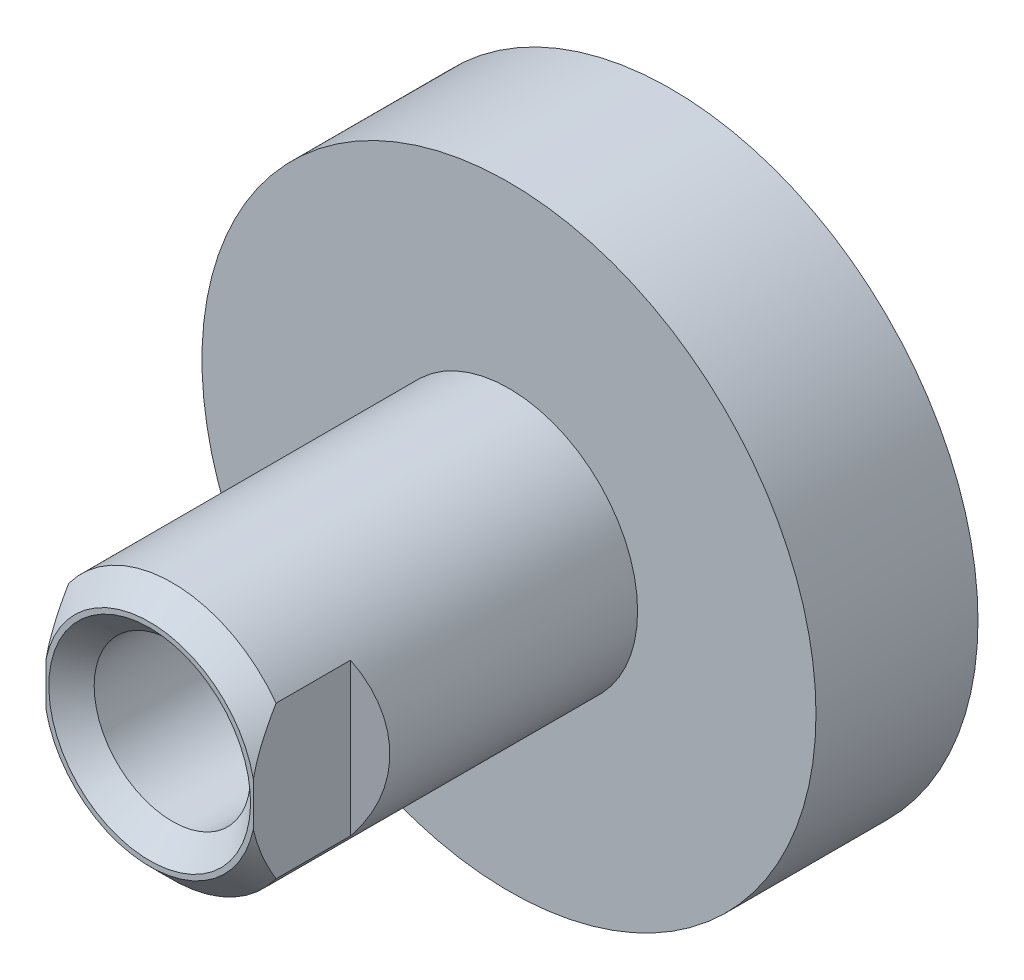
ISO-10303-21;
HEADER;
FILE_DESCRIPTION(('STEP AP214'),'2;1');
FILE_NAME('part.step','',(''),(''),'','','');
FILE_SCHEMA(('AUTOMOTIVE_DESIGN { 1 0 10303 214 1 1 1 1 }'));
ENDSEC;
DATA;
#1=APPLICATION_CONTEXT('core data for automotive mechanical design processes');
#2=APPLICATION_PROTOCOL_DEFINITION('international standard','automotive_design',2000,#1);
#3=PRODUCT_CONTEXT('',#1,'mechanical');
#4=PRODUCT('Part','Part','',(#3));
#5=PRODUCT_RELATED_PRODUCT_CATEGORY('part','',(#4));
#6=PRODUCT_DEFINITION_FORMATION('','',#4);
#7=PRODUCT_DEFINITION_CONTEXT('part definition',#1,'design');
#8=PRODUCT_DEFINITION('design','',#6,#7);
#9=PRODUCT_DEFINITION_SHAPE('','',#8);
#10=(LENGTH_UNIT() NAMED_UNIT(*) SI_UNIT(.MILLI.,.METRE.));
#11=(NAMED_UNIT(*) PLANE_ANGLE_UNIT() SI_UNIT($,.RADIAN.));
#12=(NAMED_UNIT(*) SI_UNIT($,.STERADIAN.) SOLID_ANGLE_UNIT());
#13=UNCERTAINTY_MEASURE_WITH_UNIT(LENGTH_MEASURE(1.E-05),#10,'distance_accuracy_value','');
#14=(GEOMETRIC_REPRESENTATION_CONTEXT(3) GLOBAL_UNCERTAINTY_ASSIGNED_CONTEXT((#13)) GLOBAL_UNIT_ASSIGNED_CONTEXT((#10,
#11,#12)) REPRESENTATION_CONTEXT('',''));
#15=CARTESIAN_POINT('',(0.,0.,0.));
#16=DIRECTION('',(0.,0.,1.));
#17=DIRECTION('',(1.,0.,0.));
#18=AXIS2_PLACEMENT_3D('',#15,#16,#17);
#19=CARTESIAN_POINT('',(0.,0.,16.089));
#20=DIRECTION('',(0.,0.,-1.));
#21=DIRECTION('',(-1.,0.,0.));
#22=AXIS2_PLACEMENT_3D('',#19,#20,#21);
#23=CONICAL_SURFACE('',#22,3.269,0.785398163397448);
#24=CARTESIAN_POINT('',(3.19999999999999,8.14438129751062,10.6075173436409));
#25=CARTESIAN_POINT('',(3.2,8.02037308018814,10.7229341446482));
#26=CARTESIAN_POINT('',(3.2,7.89619130815357,10.8381643940303));
#27=CARTESIAN_POINT('',(3.2,7.64742715659782,11.0681932844457));
#28=CARTESIAN_POINT('',(3.2,7.52284477436072,11.1829919225414));
#29=CARTESIAN_POINT('',(3.2,7.14836437921319,11.5267004394431));
#30=CARTESIAN_POINT('',(3.2,6.89778733730345,11.7548723629379));
#31=CARTESIAN_POINT('',(3.2,6.39261284344718,12.2100349201703));
#32=CARTESIAN_POINT('',(3.2,6.13799986676834,12.4370083485245));
#33=CARTESIAN_POINT('',(3.2,5.62551227541731,12.8871949873163));
#34=CARTESIAN_POINT('',(3.2,5.36763807223295,13.1104086640173));
#35=CARTESIAN_POINT('',(3.2,4.89971214701536,13.5069268406258));
#36=CARTESIAN_POINT('',(3.2,4.69050048189902,13.6812207687829));
#37=CARTESIAN_POINT('',(3.2,4.26803383605998,14.0249955334789));
#38=CARTESIAN_POINT('',(3.2,4.05477779239326,14.194475074627));
#39=CARTESIAN_POINT('',(3.2,3.73092322209976,14.4432193701575));
#40=CARTESIAN_POINT('',(3.2,3.62238631073127,14.5251668962959));
#41=CARTESIAN_POINT('',(3.2,3.40368233046347,14.6868528558357));
#42=CARTESIAN_POINT('',(3.2,3.29351534163836,14.7665913971999));
#43=CARTESIAN_POINT('',(3.2,3.0712893842568,14.923294311635));
#44=CARTESIAN_POINT('',(3.2,2.9592312394118,15.0002598489444));
#45=CARTESIAN_POINT('',(3.2,2.73282064436764,15.1507267449046));
#46=CARTESIAN_POINT('',(3.2,2.61846848068663,15.2242285323771));
#47=CARTESIAN_POINT('',(3.2,2.39605908999421,15.3612465237621));
#48=CARTESIAN_POINT('',(3.2,2.2882071597638,15.4250943433531));
#49=CARTESIAN_POINT('',(3.2,2.06978769869499,15.5480302743952));
#50=CARTESIAN_POINT('',(3.2,1.95921987355386,15.6071178670178));
#51=CARTESIAN_POINT('',(3.2,1.73505943011585,15.7191798675005));
#52=CARTESIAN_POINT('',(3.2,1.62146809440568,15.7721568182163));
#53=CARTESIAN_POINT('',(3.2,1.3909503188124,15.8703246309523));
#54=CARTESIAN_POINT('',(3.2,1.27402475256477,15.9155175110989));
#55=CARTESIAN_POINT('',(3.2,1.06187602607754,15.9875629095076));
#56=CARTESIAN_POINT('',(3.2,0.967287503863236,16.0162729912688));
#57=CARTESIAN_POINT('',(3.2,0.776227103303562,16.0664892488793));
#58=CARTESIAN_POINT('',(3.2,0.679755934099508,16.0879980838546));
#59=CARTESIAN_POINT('',(3.2,0.48564385252913,16.122761220174));
#60=CARTESIAN_POINT('',(3.2,0.388007833341308,16.1360424484125));
#61=CARTESIAN_POINT('',(3.2,0.191928289585948,16.1537358073806));
#62=CARTESIAN_POINT('',(3.2,0.093484818049692,16.1581485159609));
#63=CARTESIAN_POINT('',(3.2,-0.103718831982331,16.1578433100713));
#64=CARTESIAN_POINT('',(3.2,-0.202478963890203,16.1530946845424));
#65=CARTESIAN_POINT('',(3.2,-0.399158101390743,16.1346888320718));
#66=CARTESIAN_POINT('',(3.2,-0.497077042041231,16.1210309234622));
#67=CARTESIAN_POINT('',(3.2,-0.691711686461295,16.0854976317301));
#68=CARTESIAN_POINT('',(3.2,-0.78842261557017,16.0635964416367));
#69=CARTESIAN_POINT('',(3.2,-0.979900030774677,16.0126019814806));
#70=CARTESIAN_POINT('',(3.2,-1.0746664026529,15.9835082902543));
#71=CARTESIAN_POINT('',(3.2,-1.37282760748716,15.8812639428482));
#72=CARTESIAN_POINT('',(3.2,-1.57232085478202,15.7966640448146));
#73=CARTESIAN_POINT('',(3.2,-1.86445188421096,15.6554439545493));
#74=CARTESIAN_POINT('',(3.2,-1.96074893080725,15.6059197554249));
#75=CARTESIAN_POINT('',(3.2,-2.15123150463879,15.5029531193866));
#76=CARTESIAN_POINT('',(3.2,-2.24541728809823,15.4495111613329));
#77=CARTESIAN_POINT('',(3.2,-2.52756244568976,15.2830523166552));
#78=CARTESIAN_POINT('',(3.2,-2.71262501615535,15.1651491858317));
#79=CARTESIAN_POINT('',(3.2,-3.07672694966975,14.9208684287651));
#80=CARTESIAN_POINT('',(3.2,-3.25577156378677,14.794498494667));
#81=CARTESIAN_POINT('',(3.2,-3.64856538100882,14.5071964420652));
#82=CARTESIAN_POINT('',(3.2,-3.86123758925456,14.3447990689844));
#83=CARTESIAN_POINT('',(3.2,-4.28190778614149,14.0140383565508));
#84=CARTESIAN_POINT('',(3.2,-4.48990494697841,13.8456739740176));
#85=CARTESIAN_POINT('',(3.2,-4.90264475624502,13.5045884805727));
#86=CARTESIAN_POINT('',(3.2,-5.10738383087042,13.3318630597682));
#87=CARTESIAN_POINT('',(3.2,-5.51425291050597,12.9833640988763));
#88=CARTESIAN_POINT('',(3.2,-5.71638284006402,12.8075904709829));
#89=CARTESIAN_POINT('',(3.2,-6.1059784376609,12.4648910915724));
#90=CARTESIAN_POINT('',(3.2,-6.29356666062253,12.2981043868875));
#91=CARTESIAN_POINT('',(3.2,-6.66734160878533,11.9629607060605));
#92=CARTESIAN_POINT('',(3.2,-6.85352830014715,11.7946036922224));
#93=CARTESIAN_POINT('',(3.2,-7.22435587669843,11.4570236100675));
#94=CARTESIAN_POINT('',(3.2,-7.40899928116295,11.2878033057933));
#95=CARTESIAN_POINT('',(3.2,-7.7773450218923,10.9483589135239));
#96=CARTESIAN_POINT('',(3.19999999999999,-7.96104740308264,10.7781348742987));
#97=CARTESIAN_POINT('',(3.19999999999999,-8.14438129751062,10.6075173436409));
#98=B_SPLINE_CURVE_WITH_KNOTS('',3,(#24,#25,#26,#27,#28,#29,#30,#31,#32,#33,#34,#35,#36,#37,#38,
#39,#40,#41,#42,#43,#44,#45,#46,#47,#48,#49,#50,#51,#52,#53,#54,#55,#56,#57,#58,#59,#60,#61,#62,
#63,#64,#65,#66,#67,#68,#69,#70,#71,#72,#73,#74,#75,#76,#77,#78,#79,#80,#81,#82,#83,#84,#85,#86,
#87,#88,#89,#90,#91,#92,#93,#94,#95,#96,#97),.UNSPECIFIED.,.F.,.F.,(4,2,2,2,2,2,2,2,2,2,2,2,2,2,
2,2,2,2,2,2,2,2,2,2,2,2,2,2,2,2,2,2,2,2,2,2,4),(0.,0.508223600721031,1.01645065422075,
2.03312715809559,3.05638425323574,4.07951350132211,4.89637258055815,5.71344940656963,
6.12142441715369,6.52937945290761,6.93716116506577,7.34489225938648,7.72079973744586,
8.09674813128381,8.47253951083689,8.8482333142137,9.14454437301952,9.44074589527895,
9.73597283083189,10.0311805295105,10.3273795571831,10.6236012503242,10.9207581345656,
11.2179324232279,11.8661091587113,12.1909329034028,12.5157170114934,13.1736035461006,
13.8309002854507,14.633489052037,15.4362188298515,16.239775635615,17.0433556270675,
17.7963816105743,18.5494257176156,19.3007926240954,20.0521233187582),.UNSPECIFIED.);
#99=CARTESIAN_POINT('',(3.2,2.34796954835449,15.389));
#100=VERTEX_POINT('',#99);
#101=CARTESIAN_POINT('',(3.2,0.668102537040538,16.089));
#102=VERTEX_POINT('',#101);
#103=EDGE_CURVE('E42',#100,#102,#98,.T.);
#104=ORIENTED_EDGE('',*,*,#103,.F.);
#105=CARTESIAN_POINT('',(0.,0.,15.389));
#106=DIRECTION('',(0.,0.,-1.));
#107=DIRECTION('',(-1.,0.,0.));
#108=AXIS2_PLACEMENT_3D('',#105,#106,#107);
#109=CIRCLE('',#108,3.969);
#110=CARTESIAN_POINT('',(-3.2,2.34796954835449,15.389));
#111=VERTEX_POINT('',#110);
#112=EDGE_CURVE('E114',#111,#100,#109,.T.);
#113=ORIENTED_EDGE('',*,*,#112,.F.);
#114=CARTESIAN_POINT('',(-3.2,-8.14438129751062,10.6075173436409));
#115=CARTESIAN_POINT('',(-3.2,-8.02037308018814,10.7229341446482));
#116=CARTESIAN_POINT('',(-3.2,-7.89619130815357,10.8381643940303));
#117=CARTESIAN_POINT('',(-3.2,-7.64742715659782,11.0681932844457));
#118=CARTESIAN_POINT('',(-3.2,-7.52284477436072,11.1829919225414));
#119=CARTESIAN_POINT('',(-3.2,-7.14836437921319,11.5267004394431));
#120=CARTESIAN_POINT('',(-3.2,-6.89778733730345,11.7548723629379));
#121=CARTESIAN_POINT('',(-3.2,-6.39261284344718,12.2100349201703));
#122=CARTESIAN_POINT('',(-3.2,-6.13799986676834,12.4370083485245));
#123=CARTESIAN_POINT('',(-3.2,-5.62551227541731,12.8871949873163));
#124=CARTESIAN_POINT('',(-3.2,-5.36763807223295,13.1104086640173));
#125=CARTESIAN_POINT('',(-3.2,-4.89971214701536,13.5069268406258));
#126=CARTESIAN_POINT('',(-3.2,-4.69050048189902,13.6812207687829));
#127=CARTESIAN_POINT('',(-3.2,-4.26803383605998,14.0249955334789));
#128=CARTESIAN_POINT('',(-3.2,-4.05477779239326,14.1944750746269));
#129=CARTESIAN_POINT('',(-3.2,-3.73092322209977,14.4432193701575));
#130=CARTESIAN_POINT('',(-3.2,-3.62238631073127,14.5251668962959));
#131=CARTESIAN_POINT('',(-3.2,-3.40368233046347,14.6868528558357));
#132=CARTESIAN_POINT('',(-3.2,-3.29351534163836,14.7665913971999));
#133=CARTESIAN_POINT('',(-3.2,-3.07128938425681,14.923294311635));
#134=CARTESIAN_POINT('',(-3.2,-2.9592312394118,15.0002598489444));
#135=CARTESIAN_POINT('',(-3.2,-2.73282064436765,15.1507267449046));
#136=CARTESIAN_POINT('',(-3.2,-2.61846848068664,15.2242285323771));
#137=CARTESIAN_POINT('',(-3.2,-2.39605908999422,15.3612465237621));
#138=CARTESIAN_POINT('',(-3.2,-2.28820715976381,15.4250943433531));
#139=CARTESIAN_POINT('',(-3.2,-2.06978769869499,15.5480302743952));
#140=CARTESIAN_POINT('',(-3.2,-1.95921987355387,15.6071178670178));
#141=CARTESIAN_POINT('',(-3.2,-1.73505943011585,15.7191798675005));
#142=CARTESIAN_POINT('',(-3.2,-1.62146809440568,15.7721568182163));
#143=CARTESIAN_POINT('',(-3.2,-1.3909503188124,15.8703246309523));
#144=CARTESIAN_POINT('',(-3.2,-1.27402475256478,15.9155175110989));
#145=CARTESIAN_POINT('',(-3.2,-1.06187602607755,15.9875629095076));
#146=CARTESIAN_POINT('',(-3.2,-0.96728750386324,16.0162729912688));
#147=CARTESIAN_POINT('',(-3.2,-0.776227103303566,16.0664892488793));
#148=CARTESIAN_POINT('',(-3.2,-0.679755934099511,16.0879980838546));
#149=CARTESIAN_POINT('',(-3.2,-0.485643852529132,16.122761220174));
#150=CARTESIAN_POINT('',(-3.2,-0.388007833341309,16.1360424484125));
#151=CARTESIAN_POINT('',(-3.2,-0.191928289585948,16.1537358073806));
#152=CARTESIAN_POINT('',(-3.2,-0.0934848180496922,16.1581485159609));
#153=CARTESIAN_POINT('',(-3.2,0.103718831982331,16.1578433100713));
#154=CARTESIAN_POINT('',(-3.2,0.202478963890203,16.1530946845424));
#155=CARTESIAN_POINT('',(-3.2,0.399158101390743,16.1346888320718));
#156=CARTESIAN_POINT('',(-3.2,0.497077042041231,16.1210309234622));
#157=CARTESIAN_POINT('',(-3.2,0.691711686461295,16.0854976317301));
#158=CARTESIAN_POINT('',(-3.2,0.78842261557017,16.0635964416367));
#159=CARTESIAN_POINT('',(-3.2,0.979900030774678,16.0126019814806));
#160=CARTESIAN_POINT('',(-3.2,1.0746664026529,15.9835082902543));
#161=CARTESIAN_POINT('',(-3.2,1.37282760748716,15.8812639428482));
#162=CARTESIAN_POINT('',(-3.2,1.57232085478202,15.7966640448146));
#163=CARTESIAN_POINT('',(-3.2,1.86445188421096,15.6554439545493));
#164=CARTESIAN_POINT('',(-3.2,1.96074893080725,15.6059197554249));
#165=CARTESIAN_POINT('',(-3.2,2.15123150463879,15.5029531193866));
#166=CARTESIAN_POINT('',(-3.2,2.24541728809823,15.4495111613329));
#167=CARTESIAN_POINT('',(-3.2,2.52756244568976,15.2830523166552));
#168=CARTESIAN_POINT('',(-3.2,2.71262501615535,15.1651491858317));
#169=CARTESIAN_POINT('',(-3.2,3.07672694966975,14.9208684287651));
#170=CARTESIAN_POINT('',(-3.2,3.25577156378677,14.794498494667));
#171=CARTESIAN_POINT('',(-3.2,3.64856538100882,14.5071964420652));
#172=CARTESIAN_POINT('',(-3.2,3.86123758925456,14.3447990689844));
#173=CARTESIAN_POINT('',(-3.2,4.28190778614149,14.0140383565508));
#174=CARTESIAN_POINT('',(-3.2,4.48990494697841,13.8456739740176));
#175=CARTESIAN_POINT('',(-3.2,4.90264475624502,13.5045884805727));
#176=CARTESIAN_POINT('',(-3.2,5.10738383087042,13.3318630597682));
#177=CARTESIAN_POINT('',(-3.2,5.51425291050597,12.9833640988763));
#178=CARTESIAN_POINT('',(-3.2,5.71638284006402,12.8075904709829));
#179=CARTESIAN_POINT('',(-3.2,6.1059784376609,12.4648910915724));
#180=CARTESIAN_POINT('',(-3.2,6.29356666062252,12.2981043868875));
#181=CARTESIAN_POINT('',(-3.2,6.66734160878533,11.9629607060605));
#182=CARTESIAN_POINT('',(-3.2,6.85352830014715,11.7946036922224));
#183=CARTESIAN_POINT('',(-3.2,7.22435587669843,11.4570236100675));
#184=CARTESIAN_POINT('',(-3.2,7.40899928116296,11.2878033057933));
#185=CARTESIAN_POINT('',(-3.2,7.7773450218923,10.9483589135239));
#186=CARTESIAN_POINT('',(-3.2,7.96104740308264,10.7781348742987));
#187=CARTESIAN_POINT('',(-3.2,8.14438129751062,10.6075173436409));
#188=B_SPLINE_CURVE_WITH_KNOTS('',3,(#114,#115,#116,#117,#118,#119,#120,#121,#122,#123,#124,
#125,#126,#127,#128,#129,#130,#131,#132,#133,#134,#135,#136,#137,#138,#139,#140,#141,#142,#143,
#144,#145,#146,#147,#148,#149,#150,#151,#152,#153,#154,#155,#156,#157,#158,#159,#160,#161,#162,
#163,#164,#165,#166,#167,#168,#169,#170,#171,#172,#173,#174,#175,#176,#177,#178,#179,#180,#181,
#182,#183,#184,#185,#186,#187),.UNSPECIFIED.,.F.,.F.,(4,2,2,2,2,2,2,2,2,2,2,2,2,2,2,2,2,2,2,2,2,
2,2,2,2,2,2,2,2,2,2,2,2,2,2,2,4),(0.,0.50822360072103,1.01645065422074,2.03312715809559,
3.05638425323574,4.07951350132211,4.89637258055815,5.71344940656962,6.12142441715369,
6.5293794529076,6.93716116506577,7.34489225938647,7.72079973744586,8.0967481312838,
8.47253951083689,8.84823331421369,9.14454437301952,9.44074589527894,9.73597283083189,
10.0311805295105,10.327379557183,10.6236012503242,10.9207581345656,11.2179324232279,
11.8661091587113,12.1909329034028,12.5157170114934,13.1736035461005,13.8309002854506,
14.633489052037,15.4362188298515,16.239775635615,17.0433556270675,17.7963816105743,
18.5494257176156,19.3007926240954,20.0521233187582),.UNSPECIFIED.);
#189=CARTESIAN_POINT('',(-3.2,0.668102537040528,16.089));
#190=VERTEX_POINT('',#189);
#191=EDGE_CURVE('E105',#190,#111,#188,.T.);
#192=ORIENTED_EDGE('',*,*,#191,.F.);
#193=CARTESIAN_POINT('',(0.,0.,16.089));
#194=DIRECTION('',(0.,0.,-1.));
#195=DIRECTION('',(0.,1.,0.));
#196=AXIS2_PLACEMENT_3D('',#193,#194,#195);
#197=CIRCLE('',#196,3.269);
#198=EDGE_CURVE('E56',#102,#190,#197,.F.);
#199=ORIENTED_EDGE('',*,*,#198,.F.);
#200=EDGE_LOOP('',(#104,#113,#192,#199));
#201=FACE_BOUND('',#200,.T.);
#202=ADVANCED_FACE('F34',(#201),#23,.T.);
#203=CARTESIAN_POINT('',(0.,0.,5.));
#204=DIRECTION('',(0.,0.,-1.));
#205=DIRECTION('',(-1.,0.,0.));
#206=AXIS2_PLACEMENT_3D('',#203,#204,#205);
#207=CYLINDRICAL_SURFACE('',#206,9.475);
#208=CARTESIAN_POINT('',(0.,0.,5.));
#209=DIRECTION('',(0.,0.,1.));
#210=DIRECTION('',(1.,0.,0.));
#211=AXIS2_PLACEMENT_3D('',#208,#209,#210);
#212=CIRCLE('',#211,9.475);
#213=CARTESIAN_POINT('',(9.475,0.,5.));
#214=VERTEX_POINT('',#213);
#215=EDGE_CURVE('E180',#214,#214,#212,.T.);
#216=ORIENTED_EDGE('',*,*,#215,.F.);
#217=EDGE_LOOP('',(#216));
#218=FACE_BOUND('',#217,.T.);
#219=CARTESIAN_POINT('',(0.,0.,0.));
#220=DIRECTION('',(0.,0.,1.));
#221=DIRECTION('',(1.,0.,0.));
#222=AXIS2_PLACEMENT_3D('',#219,#220,#221);
#223=CIRCLE('',#222,9.475);
#224=CARTESIAN_POINT('',(9.475,0.,0.));
#225=VERTEX_POINT('',#224);
#226=EDGE_CURVE('E183',#225,#225,#223,.T.);
#227=ORIENTED_EDGE('',*,*,#226,.T.);
#228=EDGE_LOOP('',(#227));
#229=FACE_BOUND('',#228,.T.);
#230=ADVANCED_FACE('F168',(#218,#229),#207,.T.);
#231=CARTESIAN_POINT('',(0.,0.,5.));
#232=DIRECTION('',(0.,0.,1.));
#233=DIRECTION('',(1.,0.,0.));
#234=AXIS2_PLACEMENT_3D('',#231,#232,#233);
#235=PLANE('',#234);
#236=CARTESIAN_POINT('',(0.,0.,5.));
#237=DIRECTION('',(0.,0.,1.));
#238=DIRECTION('',(1.,0.,0.));
#239=AXIS2_PLACEMENT_3D('',#236,#237,#238);
#240=CIRCLE('',#239,3.969);
#241=CARTESIAN_POINT('',(3.969,0.,5.));
#242=VERTEX_POINT('',#241);
#243=EDGE_CURVE('E110',#242,#242,#240,.T.);
#244=ORIENTED_EDGE('',*,*,#243,.F.);
#245=EDGE_LOOP('',(#244));
#246=FACE_BOUND('',#245,.T.);
#247=ORIENTED_EDGE('',*,*,#215,.T.);
#248=EDGE_LOOP('',(#247));
#249=FACE_BOUND('',#248,.T.);
#250=ADVANCED_FACE('F165',(#246,#249),#235,.T.);
#251=CARTESIAN_POINT('',(0.,0.,0.));
#252=DIRECTION('',(0.,0.,1.));
#253=DIRECTION('',(1.,0.,0.));
#254=AXIS2_PLACEMENT_3D('',#251,#252,#253);
#255=PLANE('',#254);
#256=ORIENTED_EDGE('',*,*,#226,.F.);
#257=EDGE_LOOP('',(#256));
#258=FACE_BOUND('',#257,.T.);
#259=ADVANCED_FACE('F163',(#258),#255,.F.);
#260=CARTESIAN_POINT('',(0.,0.,27.3150272581176));
#261=DIRECTION('',(0.,0.,-1.));
#262=DIRECTION('',(-1.,0.,0.));
#263=AXIS2_PLACEMENT_3D('',#260,#261,#262);
#264=CYLINDRICAL_SURFACE('',#263,3.969);
#265=DIRECTION('',(0.,0.,-1.));
#266=VECTOR('',#265,1.);
#267=CARTESIAN_POINT('',(3.20000000000001,2.34796954835448,27.3150272581176));
#268=LINE('',#267,#266);
#269=CARTESIAN_POINT('',(3.2,2.34796954835448,13.089));
#270=VERTEX_POINT('',#269);
#271=EDGE_CURVE('E91',#270,#100,#268,.F.);
#272=ORIENTED_EDGE('',*,*,#271,.F.);
#273=CARTESIAN_POINT('',(0.,0.,14.9365208614068));
#274=DIRECTION('',(-0.500000000000004,0.,-0.866025403784436));
#275=DIRECTION('',(0.866025403784436,0.,-0.500000000000004));
#276=AXIS2_PLACEMENT_3D('',#273,#274,#275);
#277=ELLIPSE('',#276,4.58300643682726,3.969);
#278=CARTESIAN_POINT('',(3.2,-2.34796954835448,13.089));
#279=VERTEX_POINT('',#278);
#280=EDGE_CURVE('E12',#279,#270,#277,.F.);
#281=ORIENTED_EDGE('',*,*,#280,.F.);
#282=DIRECTION('',(0.,0.,-1.));
#283=VECTOR('',#282,1.);
#284=CARTESIAN_POINT('',(3.20000000000001,-2.34796954835448,27.3150272581176));
#285=LINE('',#284,#283);
#286=CARTESIAN_POINT('',(3.2,-2.34796954835449,15.389));
#287=VERTEX_POINT('',#286);
#288=EDGE_CURVE('E101',#287,#279,#285,.T.);
#289=ORIENTED_EDGE('',*,*,#288,.F.);
#290=CARTESIAN_POINT('',(-3.2,-2.34796954835449,15.389));
#291=VERTEX_POINT('',#290);
#292=EDGE_CURVE('E108',#287,#291,#109,.T.);
#293=ORIENTED_EDGE('',*,*,#292,.T.);
#294=DIRECTION('',(0.,0.,-1.));
#295=VECTOR('',#294,1.);
#296=CARTESIAN_POINT('',(-3.20000000000001,-2.34796954835448,27.3150272581176));
#297=LINE('',#296,#295);
#298=CARTESIAN_POINT('',(-3.2,-2.34796954835448,13.089));
#299=VERTEX_POINT('',#298);
#300=EDGE_CURVE('E197',#299,#291,#297,.F.);
#301=ORIENTED_EDGE('',*,*,#300,.F.);
#302=CARTESIAN_POINT('',(0.,0.,14.9365208614068));
#303=DIRECTION('',(0.500000000000004,0.,-0.866025403784436));
#304=DIRECTION('',(-0.866025403784436,0.,-0.500000000000004));
#305=AXIS2_PLACEMENT_3D('',#302,#303,#304);
#306=ELLIPSE('',#305,4.58300643682726,3.969);
#307=CARTESIAN_POINT('',(-3.2,2.34796954835448,13.089));
#308=VERTEX_POINT('',#307);
#309=EDGE_CURVE('E126',#308,#299,#306,.F.);
#310=ORIENTED_EDGE('',*,*,#309,.F.);
#311=DIRECTION('',(0.,0.,-1.));
#312=VECTOR('',#311,1.);
#313=CARTESIAN_POINT('',(-3.20000000000001,2.34796954835448,27.3150272581176));
#314=LINE('',#313,#312);
#315=EDGE_CURVE('E200',#111,#308,#314,.T.);
#316=ORIENTED_EDGE('',*,*,#315,.F.);
#317=ORIENTED_EDGE('',*,*,#112,.T.);
#318=EDGE_LOOP('',(#272,#281,#289,#293,#301,#310,#316,#317));
#319=FACE_BOUND('',#318,.T.);
#320=ORIENTED_EDGE('',*,*,#243,.T.);
#321=EDGE_LOOP('',(#320));
#322=FACE_BOUND('',#321,.T.);
#323=ADVANCED_FACE('F160',(#319,#322),#264,.T.);
#324=CARTESIAN_POINT('',(0.,0.,16.089));
#325=DIRECTION('',(0.,0.,-1.));
#326=DIRECTION('',(0.,1.,0.));
#327=AXIS2_PLACEMENT_3D('',#324,#325,#326);
#328=PLANE('',#327);
#329=CARTESIAN_POINT('',(-3.2,-0.668102537040528,16.089));
#330=VERTEX_POINT('',#329);
#331=CARTESIAN_POINT('',(3.2,-0.66810253704054,16.089));
#332=VERTEX_POINT('',#331);
#333=EDGE_CURVE('E100',#330,#332,#197,.F.);
#334=ORIENTED_EDGE('',*,*,#333,.T.);
#335=DIRECTION('',(0.,1.,0.));
#336=VECTOR('',#335,1.);
#337=CARTESIAN_POINT('',(3.2,-9.475,16.089));
#338=LINE('',#337,#336);
#339=EDGE_CURVE('E49',#332,#102,#338,.T.);
#340=ORIENTED_EDGE('',*,*,#339,.T.);
#341=ORIENTED_EDGE('',*,*,#198,.T.);
#342=DIRECTION('',(0.,1.,0.));
#343=VECTOR('',#342,1.);
#344=CARTESIAN_POINT('',(-3.2,-9.475,16.089));
#345=LINE('',#344,#343);
#346=EDGE_CURVE('E203',#330,#190,#345,.T.);
#347=ORIENTED_EDGE('',*,*,#346,.F.);
#348=EDGE_LOOP('',(#334,#340,#341,#347));
#349=FACE_BOUND('',#348,.T.);
#350=CARTESIAN_POINT('',(0.,0.,16.089));
#351=DIRECTION('',(0.,0.,-1.));
#352=DIRECTION('',(0.,1.,0.));
#353=AXIS2_PLACEMENT_3D('',#350,#351,#352);
#354=CIRCLE('',#353,3.113);
#355=CARTESIAN_POINT('',(0.,3.113,16.089));
#356=VERTEX_POINT('',#355);
#357=EDGE_CURVE('E106',#356,#356,#354,.T.);
#358=ORIENTED_EDGE('',*,*,#357,.T.);
#359=EDGE_LOOP('',(#358));
#360=FACE_BOUND('',#359,.T.);
#361=ADVANCED_FACE('F97',(#349,#360),#328,.F.);
#362=CARTESIAN_POINT('',(0.,0.,16.089));
#363=DIRECTION('',(0.,0.,1.));
#364=DIRECTION('',(0.,-1.,0.));
#365=AXIS2_PLACEMENT_3D('',#362,#363,#364);
#366=CYLINDRICAL_SURFACE('',#365,2.413);
#367=CARTESIAN_POINT('',(0.,0.,15.389));
#368=DIRECTION('',(0.,0.,-1.));
#369=DIRECTION('',(0.,1.,0.));
#370=AXIS2_PLACEMENT_3D('',#367,#368,#369);
#371=CIRCLE('',#370,2.413);
#372=CARTESIAN_POINT('',(0.,2.413,15.389));
#373=VERTEX_POINT('',#372);
#374=EDGE_CURVE('E116',#373,#373,#371,.F.);
#375=ORIENTED_EDGE('',*,*,#374,.T.);
#376=EDGE_LOOP('',(#375));
#377=FACE_BOUND('',#376,.T.);
#378=CARTESIAN_POINT('',(0.,0.,6.94500000000001));
#379=DIRECTION('',(0.,0.,1.));
#380=DIRECTION('',(0.,-1.,0.));
#381=AXIS2_PLACEMENT_3D('',#378,#379,#380);
#382=CIRCLE('',#381,2.413);
#383=CARTESIAN_POINT('',(0.,-2.413,6.94500000000001));
#384=VERTEX_POINT('',#383);
#385=EDGE_CURVE('E184',#384,#384,#382,.T.);
#386=ORIENTED_EDGE('',*,*,#385,.F.);
#387=EDGE_LOOP('',(#386));
#388=FACE_BOUND('',#387,.T.);
#389=ADVANCED_FACE('F153',(#377,#388),#366,.F.);
#390=CARTESIAN_POINT('',(2.0193,0.,6.94500000000001));
#391=DIRECTION('',(0.,0.,-1.));
#392=DIRECTION('',(0.,1.,0.));
#393=AXIS2_PLACEMENT_3D('',#390,#391,#392);
#394=PLANE('',#393);
#395=CARTESIAN_POINT('',(0.,0.,6.94500000000001));
#396=DIRECTION('',(0.,0.,1.));
#397=DIRECTION('',(0.,-1.,0.));
#398=AXIS2_PLACEMENT_3D('',#395,#396,#397);
#399=CIRCLE('',#398,2.0193);
#400=CARTESIAN_POINT('',(0.,-2.0193,6.94500000000001));
#401=VERTEX_POINT('',#400);
#402=EDGE_CURVE('E187',#401,#401,#399,.T.);
#403=ORIENTED_EDGE('',*,*,#402,.F.);
#404=EDGE_LOOP('',(#403));
#405=FACE_BOUND('',#404,.T.);
#406=ORIENTED_EDGE('',*,*,#385,.T.);
#407=EDGE_LOOP('',(#406));
#408=FACE_BOUND('',#407,.T.);
#409=ADVANCED_FACE('F149',(#405,#408),#394,.F.);
#410=CARTESIAN_POINT('',(0.,0.,16.089));
#411=DIRECTION('',(0.,0.,1.));
#412=DIRECTION('',(0.,-1.,0.));
#413=AXIS2_PLACEMENT_3D('',#410,#411,#412);
#414=CYLINDRICAL_SURFACE('',#413,2.0193);
#415=CARTESIAN_POINT('',(0.,0.,4.58900000000001));
#416=DIRECTION('',(0.,0.,1.));
#417=DIRECTION('',(0.,-1.,0.));
#418=AXIS2_PLACEMENT_3D('',#415,#416,#417);
#419=CIRCLE('',#418,2.0193);
#420=CARTESIAN_POINT('',(0.,-2.0193,4.58900000000001));
#421=VERTEX_POINT('',#420);
#422=EDGE_CURVE('E194',#421,#421,#419,.T.);
#423=ORIENTED_EDGE('',*,*,#422,.F.);
#424=EDGE_LOOP('',(#423));
#425=FACE_BOUND('',#424,.T.);
#426=ORIENTED_EDGE('',*,*,#402,.T.);
#427=EDGE_LOOP('',(#426));
#428=FACE_BOUND('',#427,.T.);
#429=ADVANCED_FACE('F145',(#425,#428),#414,.F.);
#430=CARTESIAN_POINT('',(0.,0.,4.58900000000001));
#431=DIRECTION('',(0.,0.,1.));
#432=DIRECTION('',(0.,-1.,0.));
#433=AXIS2_PLACEMENT_3D('',#430,#431,#432);
#434=CONICAL_SURFACE('',#433,2.0193,1.02974425867665);
#435=CARTESIAN_POINT('',(0.,0.,3.37568215199765));
#436=VERTEX_POINT('',#435);
#437=VERTEX_LOOP('',#436);
#438=FACE_BOUND('',#437,.T.);
#439=ORIENTED_EDGE('',*,*,#422,.T.);
#440=EDGE_LOOP('',(#439));
#441=FACE_BOUND('',#440,.T.);
#442=ADVANCED_FACE('F142',(#438,#441),#434,.F.);
#443=EDGE_CURVE('E95',#332,#287,#98,.T.);
#444=ORIENTED_EDGE('',*,*,#443,.F.);
#445=ORIENTED_EDGE('',*,*,#333,.F.);
#446=EDGE_CURVE('E125',#291,#330,#188,.T.);
#447=ORIENTED_EDGE('',*,*,#446,.F.);
#448=ORIENTED_EDGE('',*,*,#292,.F.);
#449=EDGE_LOOP('',(#444,#445,#447,#448));
#450=FACE_BOUND('',#449,.T.);
#451=ADVANCED_FACE('F127',(#450),#23,.T.);
#452=CARTESIAN_POINT('',(0.,0.,15.389));
#453=DIRECTION('',(0.,0.,1.));
#454=DIRECTION('',(0.,-1.,0.));
#455=AXIS2_PLACEMENT_3D('',#452,#453,#454);
#456=CONICAL_SURFACE('',#455,2.413,0.785398163397451);
#457=ORIENTED_EDGE('',*,*,#357,.F.);
#458=EDGE_LOOP('',(#457));
#459=FACE_BOUND('',#458,.T.);
#460=ORIENTED_EDGE('',*,*,#374,.F.);
#461=EDGE_LOOP('',(#460));
#462=FACE_BOUND('',#461,.T.);
#463=ADVANCED_FACE('F36',(#459,#462),#456,.F.);
#464=CARTESIAN_POINT('',(-3.2,-9.475,13.089));
#465=DIRECTION('',(0.500000000000004,0.,-0.866025403784436));
#466=DIRECTION('',(-0.866025403784436,0.,-0.500000000000004));
#467=AXIS2_PLACEMENT_3D('',#464,#465,#466);
#468=PLANE('',#467);
#469=ORIENTED_EDGE('',*,*,#309,.T.);
#470=DIRECTION('',(0.,1.,0.));
#471=VECTOR('',#470,1.);
#472=CARTESIAN_POINT('',(-3.2,-9.475,13.089));
#473=LINE('',#472,#471);
#474=EDGE_CURVE('E202',#299,#308,#473,.T.);
#475=ORIENTED_EDGE('',*,*,#474,.T.);
#476=EDGE_LOOP('',(#469,#475));
#477=FACE_BOUND('',#476,.T.);
#478=ADVANCED_FACE('F136',(#477),#468,.F.);
#479=CARTESIAN_POINT('',(-3.2,-9.475,16.089));
#480=DIRECTION('',(1.,0.,0.));
#481=DIRECTION('',(0.,0.,-1.));
#482=AXIS2_PLACEMENT_3D('',#479,#480,#481);
#483=PLANE('',#482);
#484=ORIENTED_EDGE('',*,*,#300,.T.);
#485=ORIENTED_EDGE('',*,*,#446,.T.);
#486=ORIENTED_EDGE('',*,*,#346,.T.);
#487=ORIENTED_EDGE('',*,*,#191,.T.);
#488=ORIENTED_EDGE('',*,*,#315,.T.);
#489=ORIENTED_EDGE('',*,*,#474,.F.);
#490=EDGE_LOOP('',(#484,#485,#486,#487,#488,#489));
#491=FACE_BOUND('',#490,.T.);
#492=ADVANCED_FACE('F130',(#491),#483,.F.);
#493=CARTESIAN_POINT('',(3.2,-9.475,13.089));
#494=DIRECTION('',(-0.500000000000004,0.,-0.866025403784436));
#495=DIRECTION('',(-0.866025403784436,0.,0.500000000000004));
#496=AXIS2_PLACEMENT_3D('',#493,#494,#495);
#497=PLANE('',#496);
#498=ORIENTED_EDGE('',*,*,#280,.T.);
#499=DIRECTION('',(0.,1.,0.));
#500=VECTOR('',#499,1.);
#501=CARTESIAN_POINT('',(3.2,-9.475,13.089));
#502=LINE('',#501,#500);
#503=EDGE_CURVE('E102',#279,#270,#502,.T.);
#504=ORIENTED_EDGE('',*,*,#503,.F.);
#505=EDGE_LOOP('',(#498,#504));
#506=FACE_BOUND('',#505,.T.);
#507=ADVANCED_FACE('F135',(#506),#497,.F.);
#508=CARTESIAN_POINT('',(3.2,-9.475,16.089));
#509=DIRECTION('',(-1.,0.,0.));
#510=DIRECTION('',(0.,0.,1.));
#511=AXIS2_PLACEMENT_3D('',#508,#509,#510);
#512=PLANE('',#511);
#513=ORIENTED_EDGE('',*,*,#271,.T.);
#514=ORIENTED_EDGE('',*,*,#103,.T.);
#515=ORIENTED_EDGE('',*,*,#339,.F.);
#516=ORIENTED_EDGE('',*,*,#443,.T.);
#517=ORIENTED_EDGE('',*,*,#288,.T.);
#518=ORIENTED_EDGE('',*,*,#503,.T.);
#519=EDGE_LOOP('',(#513,#514,#515,#516,#517,#518));
#520=FACE_BOUND('',#519,.T.);
#521=ADVANCED_FACE('F88',(#520),#512,.F.);
#522=CLOSED_SHELL('',(#202,#230,#250,#259,#323,#361,#389,#409,#429,#442,#451,#463,#478,#492,
#507,#521));
#523=MANIFOLD_SOLID_BREP('B2',#522);
#524=ADVANCED_BREP_SHAPE_REPRESENTATION('',(#18,#523),#14);
#525=SHAPE_DEFINITION_REPRESENTATION(#9,#524);
ENDSEC;
END-ISO-10303-21;
